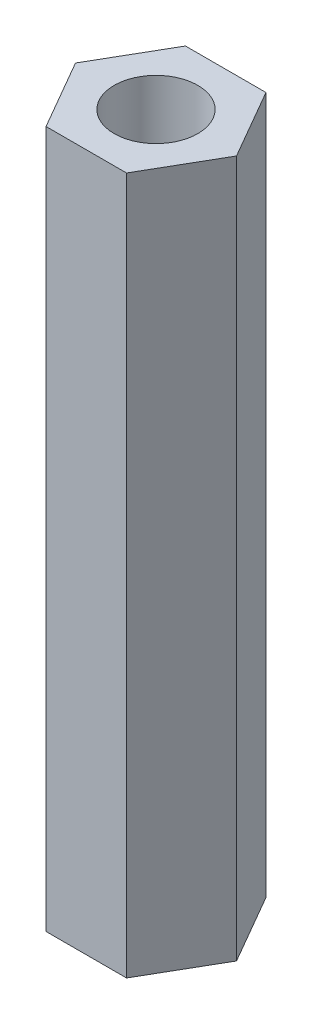
ISO-10303-21;
HEADER;
FILE_DESCRIPTION(('STEP AP214'),'2;1');
FILE_NAME('part.step','',(''),(''),'','','');
FILE_SCHEMA(('AUTOMOTIVE_DESIGN { 1 0 10303 214 1 1 1 1 }'));
ENDSEC;
DATA;
#1=APPLICATION_CONTEXT('core data for automotive mechanical design processes');
#2=APPLICATION_PROTOCOL_DEFINITION('international standard','automotive_design',2000,#1);
#3=PRODUCT_CONTEXT('',#1,'mechanical');
#4=PRODUCT('Part','Part','',(#3));
#5=PRODUCT_RELATED_PRODUCT_CATEGORY('part','',(#4));
#6=PRODUCT_DEFINITION_FORMATION('','',#4);
#7=PRODUCT_DEFINITION_CONTEXT('part definition',#1,'design');
#8=PRODUCT_DEFINITION('design','',#6,#7);
#9=PRODUCT_DEFINITION_SHAPE('','',#8);
#10=(LENGTH_UNIT() NAMED_UNIT(*) SI_UNIT(.MILLI.,.METRE.));
#11=(NAMED_UNIT(*) PLANE_ANGLE_UNIT() SI_UNIT($,.RADIAN.));
#12=(NAMED_UNIT(*) SI_UNIT($,.STERADIAN.) SOLID_ANGLE_UNIT());
#13=UNCERTAINTY_MEASURE_WITH_UNIT(LENGTH_MEASURE(1.E-05),#10,'distance_accuracy_value','');
#14=(GEOMETRIC_REPRESENTATION_CONTEXT(3) GLOBAL_UNCERTAINTY_ASSIGNED_CONTEXT((#13)) GLOBAL_UNIT_ASSIGNED_CONTEXT((#10,
#11,#12)) REPRESENTATION_CONTEXT('',''));
#15=CARTESIAN_POINT('',(0.,0.,0.));
#16=DIRECTION('',(0.,0.,1.));
#17=DIRECTION('',(1.,0.,0.));
#18=AXIS2_PLACEMENT_3D('',#15,#16,#17);
#19=CARTESIAN_POINT('',(1.44337567297409,25.,2.49999999999998));
#20=DIRECTION('',(-0.866025403784442,0.,-0.499999999999995));
#21=DIRECTION('',(-0.499999999999995,0.,0.866025403784441));
#22=AXIS2_PLACEMENT_3D('',#19,#20,#21);
#23=PLANE('',#22);
#24=DIRECTION('',(0.499999999999995,0.,-0.866025403784442));
#25=VECTOR('',#24,1.);
#26=CARTESIAN_POINT('',(1.44337567297409,0.,2.49999999999998));
#27=LINE('',#26,#25);
#28=CARTESIAN_POINT('',(1.44337567297409,0.,2.49999999999998));
#29=VERTEX_POINT('',#28);
#30=CARTESIAN_POINT('',(2.88675134594813,0.,0.));
#31=VERTEX_POINT('',#30);
#32=EDGE_CURVE('E118',#29,#31,#27,.T.);
#33=ORIENTED_EDGE('',*,*,#32,.T.);
#34=DIRECTION('',(0.,-1.,0.));
#35=VECTOR('',#34,1.);
#36=CARTESIAN_POINT('',(2.88675134594813,25.,0.));
#37=LINE('',#36,#35);
#38=CARTESIAN_POINT('',(2.88675134594813,25.,0.));
#39=VERTEX_POINT('',#38);
#40=EDGE_CURVE('E11',#39,#31,#37,.T.);
#41=ORIENTED_EDGE('',*,*,#40,.F.);
#42=DIRECTION('',(0.499999999999995,0.,-0.866025403784442));
#43=VECTOR('',#42,1.);
#44=CARTESIAN_POINT('',(1.44337567297409,25.,2.49999999999998));
#45=LINE('',#44,#43);
#46=CARTESIAN_POINT('',(1.44337567297409,25.,2.49999999999998));
#47=VERTEX_POINT('',#46);
#48=EDGE_CURVE('E129',#47,#39,#45,.T.);
#49=ORIENTED_EDGE('',*,*,#48,.F.);
#50=DIRECTION('',(0.,-1.,0.));
#51=VECTOR('',#50,1.);
#52=CARTESIAN_POINT('',(1.44337567297409,25.,2.49999999999998));
#53=LINE('',#52,#51);
#54=EDGE_CURVE('E114',#47,#29,#53,.T.);
#55=ORIENTED_EDGE('',*,*,#54,.T.);
#56=EDGE_LOOP('',(#33,#41,#49,#55));
#57=FACE_BOUND('',#56,.T.);
#58=ADVANCED_FACE('F34',(#57),#23,.F.);
#59=CARTESIAN_POINT('',(2.88675134594813,25.,0.));
#60=DIRECTION('',(-0.866025403784438,0.,0.500000000000001));
#61=DIRECTION('',(0.500000000000001,0.,0.866025403784438));
#62=AXIS2_PLACEMENT_3D('',#59,#60,#61);
#63=PLANE('',#62);
#64=DIRECTION('',(-0.500000000000001,0.,-0.866025403784438));
#65=VECTOR('',#64,1.);
#66=CARTESIAN_POINT('',(2.88675134594813,0.,0.));
#67=LINE('',#66,#65);
#68=CARTESIAN_POINT('',(1.44337567297406,0.,-2.50000000000001));
#69=VERTEX_POINT('',#68);
#70=EDGE_CURVE('E121',#31,#69,#67,.T.);
#71=ORIENTED_EDGE('',*,*,#70,.T.);
#72=DIRECTION('',(0.,-1.,0.));
#73=VECTOR('',#72,1.);
#74=CARTESIAN_POINT('',(1.44337567297406,25.,-2.50000000000001));
#75=LINE('',#74,#73);
#76=CARTESIAN_POINT('',(1.44337567297406,25.,-2.50000000000001));
#77=VERTEX_POINT('',#76);
#78=EDGE_CURVE('E42',#77,#69,#75,.T.);
#79=ORIENTED_EDGE('',*,*,#78,.F.);
#80=DIRECTION('',(-0.500000000000001,0.,-0.866025403784438));
#81=VECTOR('',#80,1.);
#82=CARTESIAN_POINT('',(2.88675134594813,25.,0.));
#83=LINE('',#82,#81);
#84=EDGE_CURVE('E87',#39,#77,#83,.T.);
#85=ORIENTED_EDGE('',*,*,#84,.F.);
#86=ORIENTED_EDGE('',*,*,#40,.T.);
#87=EDGE_LOOP('',(#71,#79,#85,#86));
#88=FACE_BOUND('',#87,.T.);
#89=ADVANCED_FACE('F154',(#88),#63,.F.);
#90=CARTESIAN_POINT('',(1.44337567297406,25.,-2.50000000000001));
#91=DIRECTION('',(0.,0.,1.));
#92=DIRECTION('',(1.,0.,0.));
#93=AXIS2_PLACEMENT_3D('',#90,#91,#92);
#94=PLANE('',#93);
#95=DIRECTION('',(-1.,0.,0.));
#96=VECTOR('',#95,1.);
#97=CARTESIAN_POINT('',(1.44337567297406,0.,-2.50000000000001));
#98=LINE('',#97,#96);
#99=CARTESIAN_POINT('',(-1.44337567297408,0.,-2.49999999999999));
#100=VERTEX_POINT('',#99);
#101=EDGE_CURVE('E124',#69,#100,#98,.T.);
#102=ORIENTED_EDGE('',*,*,#101,.T.);
#103=DIRECTION('',(0.,-1.,0.));
#104=VECTOR('',#103,1.);
#105=CARTESIAN_POINT('',(-1.44337567297408,25.,-2.49999999999999));
#106=LINE('',#105,#104);
#107=CARTESIAN_POINT('',(-1.44337567297408,25.,-2.49999999999999));
#108=VERTEX_POINT('',#107);
#109=EDGE_CURVE('E109',#108,#100,#106,.T.);
#110=ORIENTED_EDGE('',*,*,#109,.F.);
#111=DIRECTION('',(-1.,0.,0.));
#112=VECTOR('',#111,1.);
#113=CARTESIAN_POINT('',(1.44337567297406,25.,-2.50000000000001));
#114=LINE('',#113,#112);
#115=EDGE_CURVE('E100',#77,#108,#114,.T.);
#116=ORIENTED_EDGE('',*,*,#115,.F.);
#117=ORIENTED_EDGE('',*,*,#78,.T.);
#118=EDGE_LOOP('',(#102,#110,#116,#117));
#119=FACE_BOUND('',#118,.T.);
#120=ADVANCED_FACE('F135',(#119),#94,.F.);
#121=CARTESIAN_POINT('',(-1.44337567297408,25.,-2.49999999999999));
#122=DIRECTION('',(0.866025403784442,0.,0.499999999999995));
#123=DIRECTION('',(0.499999999999995,0.,-0.866025403784442));
#124=AXIS2_PLACEMENT_3D('',#121,#122,#123);
#125=PLANE('',#124);
#126=DIRECTION('',(-0.499999999999995,0.,0.866025403784441));
#127=VECTOR('',#126,1.);
#128=CARTESIAN_POINT('',(-1.44337567297408,0.,-2.49999999999999));
#129=LINE('',#128,#127);
#130=CARTESIAN_POINT('',(-2.88675134594813,0.,0.));
#131=VERTEX_POINT('',#130);
#132=EDGE_CURVE('E108',#100,#131,#129,.T.);
#133=ORIENTED_EDGE('',*,*,#132,.T.);
#134=DIRECTION('',(0.,-1.,0.));
#135=VECTOR('',#134,1.);
#136=CARTESIAN_POINT('',(-2.88675134594813,25.,0.));
#137=LINE('',#136,#135);
#138=CARTESIAN_POINT('',(-2.88675134594813,25.,0.));
#139=VERTEX_POINT('',#138);
#140=EDGE_CURVE('E105',#139,#131,#137,.T.);
#141=ORIENTED_EDGE('',*,*,#140,.F.);
#142=DIRECTION('',(-0.499999999999995,0.,0.866025403784441));
#143=VECTOR('',#142,1.);
#144=CARTESIAN_POINT('',(-1.44337567297408,25.,-2.49999999999999));
#145=LINE('',#144,#143);
#146=EDGE_CURVE('E94',#108,#139,#145,.T.);
#147=ORIENTED_EDGE('',*,*,#146,.F.);
#148=ORIENTED_EDGE('',*,*,#109,.T.);
#149=EDGE_LOOP('',(#133,#141,#147,#148));
#150=FACE_BOUND('',#149,.T.);
#151=ADVANCED_FACE('F106',(#150),#125,.F.);
#152=CARTESIAN_POINT('',(-2.88675134594813,25.,0.));
#153=DIRECTION('',(0.866025403784435,0.,-0.500000000000007));
#154=DIRECTION('',(-0.500000000000007,0.,-0.866025403784435));
#155=AXIS2_PLACEMENT_3D('',#152,#153,#154);
#156=PLANE('',#155);
#157=DIRECTION('',(0.500000000000007,0.,0.866025403784435));
#158=VECTOR('',#157,1.);
#159=CARTESIAN_POINT('',(-2.88675134594813,0.,0.));
#160=LINE('',#159,#158);
#161=CARTESIAN_POINT('',(-1.44337567297404,0.,2.50000000000001));
#162=VERTEX_POINT('',#161);
#163=EDGE_CURVE('E73',#131,#162,#160,.T.);
#164=ORIENTED_EDGE('',*,*,#163,.T.);
#165=DIRECTION('',(0.,-1.,0.));
#166=VECTOR('',#165,1.);
#167=CARTESIAN_POINT('',(-1.44337567297404,25.,2.50000000000001));
#168=LINE('',#167,#166);
#169=CARTESIAN_POINT('',(-1.44337567297404,25.,2.50000000000001));
#170=VERTEX_POINT('',#169);
#171=EDGE_CURVE('E110',#170,#162,#168,.T.);
#172=ORIENTED_EDGE('',*,*,#171,.F.);
#173=DIRECTION('',(0.500000000000007,0.,0.866025403784435));
#174=VECTOR('',#173,1.);
#175=CARTESIAN_POINT('',(-2.88675134594813,25.,0.));
#176=LINE('',#175,#174);
#177=EDGE_CURVE('E98',#139,#170,#176,.T.);
#178=ORIENTED_EDGE('',*,*,#177,.F.);
#179=ORIENTED_EDGE('',*,*,#140,.T.);
#180=EDGE_LOOP('',(#164,#172,#178,#179));
#181=FACE_BOUND('',#180,.T.);
#182=ADVANCED_FACE('F112',(#181),#156,.F.);
#183=CARTESIAN_POINT('',(-1.44337567297404,25.,2.50000000000001));
#184=DIRECTION('',(0.,0.,-1.));
#185=DIRECTION('',(-1.,0.,0.));
#186=AXIS2_PLACEMENT_3D('',#183,#184,#185);
#187=PLANE('',#186);
#188=DIRECTION('',(1.,0.,0.));
#189=VECTOR('',#188,1.);
#190=CARTESIAN_POINT('',(-1.44337567297404,0.,2.50000000000001));
#191=LINE('',#190,#189);
#192=EDGE_CURVE('E79',#162,#29,#191,.T.);
#193=ORIENTED_EDGE('',*,*,#192,.T.);
#194=ORIENTED_EDGE('',*,*,#54,.F.);
#195=DIRECTION('',(1.,0.,0.));
#196=VECTOR('',#195,1.);
#197=CARTESIAN_POINT('',(-1.44337567297404,25.,2.50000000000001));
#198=LINE('',#197,#196);
#199=EDGE_CURVE('E50',#170,#47,#198,.T.);
#200=ORIENTED_EDGE('',*,*,#199,.F.);
#201=ORIENTED_EDGE('',*,*,#171,.T.);
#202=EDGE_LOOP('',(#193,#194,#200,#201));
#203=FACE_BOUND('',#202,.T.);
#204=ADVANCED_FACE('F142',(#203),#187,.F.);
#205=CARTESIAN_POINT('',(0.,25.,0.));
#206=DIRECTION('',(0.,1.,0.));
#207=DIRECTION('',(0.,0.,1.));
#208=AXIS2_PLACEMENT_3D('',#205,#206,#207);
#209=PLANE('',#208);
#210=CARTESIAN_POINT('',(0.,25.,0.));
#211=DIRECTION('',(0.,1.,0.));
#212=DIRECTION('',(0.,0.,1.));
#213=AXIS2_PLACEMENT_3D('',#210,#211,#212);
#214=CIRCLE('',#213,1.5);
#215=CARTESIAN_POINT('',(0.,25.,1.5));
#216=VERTEX_POINT('',#215);
#217=EDGE_CURVE('E209',#216,#216,#214,.T.);
#218=ORIENTED_EDGE('',*,*,#217,.F.);
#219=EDGE_LOOP('',(#218));
#220=FACE_BOUND('',#219,.T.);
#221=ORIENTED_EDGE('',*,*,#48,.T.);
#222=ORIENTED_EDGE('',*,*,#84,.T.);
#223=ORIENTED_EDGE('',*,*,#115,.T.);
#224=ORIENTED_EDGE('',*,*,#146,.T.);
#225=ORIENTED_EDGE('',*,*,#177,.T.);
#226=ORIENTED_EDGE('',*,*,#199,.T.);
#227=EDGE_LOOP('',(#221,#222,#223,#224,#225,#226));
#228=FACE_BOUND('',#227,.T.);
#229=ADVANCED_FACE('F96',(#220,#228),#209,.T.);
#230=CARTESIAN_POINT('',(0.,0.,0.));
#231=DIRECTION('',(0.,1.,0.));
#232=DIRECTION('',(0.,0.,1.));
#233=AXIS2_PLACEMENT_3D('',#230,#231,#232);
#234=PLANE('',#233);
#235=CARTESIAN_POINT('',(0.,0.,0.));
#236=DIRECTION('',(0.,1.,0.));
#237=DIRECTION('',(0.,0.,1.));
#238=AXIS2_PLACEMENT_3D('',#235,#236,#237);
#239=CIRCLE('',#238,1.5);
#240=CARTESIAN_POINT('',(0.,0.,1.5));
#241=VERTEX_POINT('',#240);
#242=EDGE_CURVE('E122',#241,#241,#239,.T.);
#243=ORIENTED_EDGE('',*,*,#242,.T.);
#244=EDGE_LOOP('',(#243));
#245=FACE_BOUND('',#244,.T.);
#246=ORIENTED_EDGE('',*,*,#32,.F.);
#247=ORIENTED_EDGE('',*,*,#192,.F.);
#248=ORIENTED_EDGE('',*,*,#163,.F.);
#249=ORIENTED_EDGE('',*,*,#132,.F.);
#250=ORIENTED_EDGE('',*,*,#101,.F.);
#251=ORIENTED_EDGE('',*,*,#70,.F.);
#252=EDGE_LOOP('',(#246,#247,#248,#249,#250,#251));
#253=FACE_BOUND('',#252,.T.);
#254=ADVANCED_FACE('F138',(#245,#253),#234,.F.);
#255=CARTESIAN_POINT('',(0.,0.,0.));
#256=DIRECTION('',(0.,1.,0.));
#257=DIRECTION('',(0.,0.,1.));
#258=AXIS2_PLACEMENT_3D('',#255,#256,#257);
#259=CYLINDRICAL_SURFACE('',#258,1.5);
#260=ORIENTED_EDGE('',*,*,#242,.F.);
#261=EDGE_LOOP('',(#260));
#262=FACE_BOUND('',#261,.T.);
#263=ORIENTED_EDGE('',*,*,#217,.T.);
#264=EDGE_LOOP('',(#263));
#265=FACE_BOUND('',#264,.T.);
#266=ADVANCED_FACE('F191',(#262,#265),#259,.F.);
#267=CLOSED_SHELL('',(#58,#89,#120,#151,#182,#204,#229,#254,#266));
#268=MANIFOLD_SOLID_BREP('B2',#267);
#269=ADVANCED_BREP_SHAPE_REPRESENTATION('',(#18,#268),#14);
#270=SHAPE_DEFINITION_REPRESENTATION(#9,#269);
ENDSEC;
END-ISO-10303-21;
